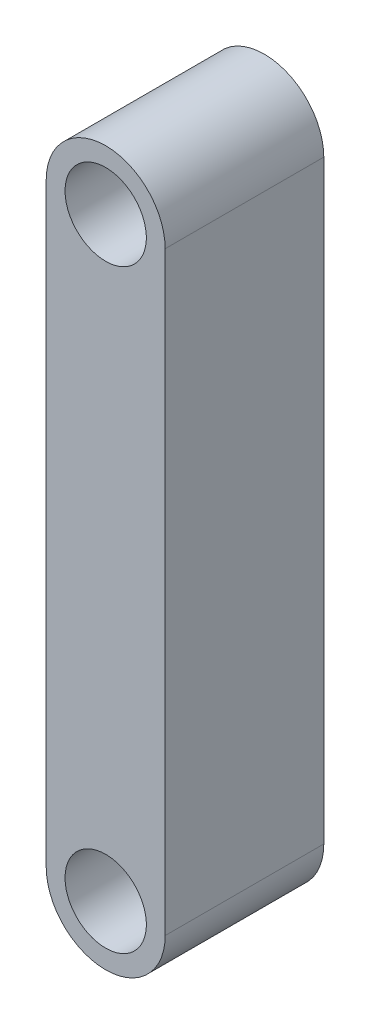
ISO-10303-21;
HEADER;
FILE_DESCRIPTION(('STEP AP214'),'2;1');
FILE_NAME('part.step','',(''),(''),'','','');
FILE_SCHEMA(('AUTOMOTIVE_DESIGN { 1 0 10303 214 1 1 1 1 }'));
ENDSEC;
DATA;
#1=APPLICATION_CONTEXT('core data for automotive mechanical design processes');
#2=APPLICATION_PROTOCOL_DEFINITION('international standard','automotive_design',2000,#1);
#3=PRODUCT_CONTEXT('',#1,'mechanical');
#4=PRODUCT('Part','Part','',(#3));
#5=PRODUCT_RELATED_PRODUCT_CATEGORY('part','',(#4));
#6=PRODUCT_DEFINITION_FORMATION('','',#4);
#7=PRODUCT_DEFINITION_CONTEXT('part definition',#1,'design');
#8=PRODUCT_DEFINITION('design','',#6,#7);
#9=PRODUCT_DEFINITION_SHAPE('','',#8);
#10=(LENGTH_UNIT() NAMED_UNIT(*) SI_UNIT(.MILLI.,.METRE.));
#11=(NAMED_UNIT(*) PLANE_ANGLE_UNIT() SI_UNIT($,.RADIAN.));
#12=(NAMED_UNIT(*) SI_UNIT($,.STERADIAN.) SOLID_ANGLE_UNIT());
#13=UNCERTAINTY_MEASURE_WITH_UNIT(LENGTH_MEASURE(1.E-05),#10,'distance_accuracy_value','');
#14=(GEOMETRIC_REPRESENTATION_CONTEXT(3) GLOBAL_UNCERTAINTY_ASSIGNED_CONTEXT((#13)) GLOBAL_UNIT_ASSIGNED_CONTEXT((#10,
#11,#12)) REPRESENTATION_CONTEXT('',''));
#15=CARTESIAN_POINT('',(0.,0.,0.));
#16=DIRECTION('',(0.,0.,1.));
#17=DIRECTION('',(1.,0.,0.));
#18=AXIS2_PLACEMENT_3D('',#15,#16,#17);
#19=CARTESIAN_POINT('',(3.,15.,8.));
#20=DIRECTION('',(1.,0.,0.));
#21=DIRECTION('',(0.,0.,-1.));
#22=AXIS2_PLACEMENT_3D('',#19,#20,#21);
#23=PLANE('',#22);
#24=DIRECTION('',(0.,-1.,0.));
#25=VECTOR('',#24,1.);
#26=CARTESIAN_POINT('',(3.,15.,0.));
#27=LINE('',#26,#25);
#28=CARTESIAN_POINT('',(3.,15.,0.));
#29=VERTEX_POINT('',#28);
#30=CARTESIAN_POINT('',(3.,-15.,0.));
#31=VERTEX_POINT('',#30);
#32=EDGE_CURVE('E117',#29,#31,#27,.T.);
#33=ORIENTED_EDGE('',*,*,#32,.F.);
#34=DIRECTION('',(0.,0.,-1.));
#35=VECTOR('',#34,1.);
#36=CARTESIAN_POINT('',(3.,15.,8.));
#37=LINE('',#36,#35);
#38=CARTESIAN_POINT('',(3.,15.,8.));
#39=VERTEX_POINT('',#38);
#40=EDGE_CURVE('E11',#39,#29,#37,.T.);
#41=ORIENTED_EDGE('',*,*,#40,.F.);
#42=DIRECTION('',(0.,-1.,0.));
#43=VECTOR('',#42,1.);
#44=CARTESIAN_POINT('',(3.,15.,8.));
#45=LINE('',#44,#43);
#46=CARTESIAN_POINT('',(3.,-15.,8.));
#47=VERTEX_POINT('',#46);
#48=EDGE_CURVE('E109',#39,#47,#45,.T.);
#49=ORIENTED_EDGE('',*,*,#48,.T.);
#50=DIRECTION('',(0.,0.,-1.));
#51=VECTOR('',#50,1.);
#52=CARTESIAN_POINT('',(3.,-15.,8.));
#53=LINE('',#52,#51);
#54=EDGE_CURVE('E48',#47,#31,#53,.T.);
#55=ORIENTED_EDGE('',*,*,#54,.T.);
#56=EDGE_LOOP('',(#33,#41,#49,#55));
#57=FACE_BOUND('',#56,.T.);
#58=ADVANCED_FACE('F45',(#57),#23,.T.);
#59=CARTESIAN_POINT('',(0.,15.,8.));
#60=DIRECTION('',(0.,0.,-1.));
#61=DIRECTION('',(-1.,0.,0.));
#62=AXIS2_PLACEMENT_3D('',#59,#60,#61);
#63=CYLINDRICAL_SURFACE('',#62,3.);
#64=CARTESIAN_POINT('',(0.,15.,0.));
#65=DIRECTION('',(0.,0.,1.));
#66=DIRECTION('',(1.,0.,0.));
#67=AXIS2_PLACEMENT_3D('',#64,#65,#66);
#68=CIRCLE('',#67,3.);
#69=CARTESIAN_POINT('',(-3.,15.,0.));
#70=VERTEX_POINT('',#69);
#71=EDGE_CURVE('E79',#29,#70,#68,.T.);
#72=ORIENTED_EDGE('',*,*,#71,.T.);
#73=DIRECTION('',(0.,0.,-1.));
#74=VECTOR('',#73,1.);
#75=CARTESIAN_POINT('',(-3.,15.,8.));
#76=LINE('',#75,#74);
#77=CARTESIAN_POINT('',(-3.,15.,8.));
#78=VERTEX_POINT('',#77);
#79=EDGE_CURVE('E55',#78,#70,#76,.T.);
#80=ORIENTED_EDGE('',*,*,#79,.F.);
#81=CARTESIAN_POINT('',(0.,15.,8.));
#82=DIRECTION('',(0.,0.,1.));
#83=DIRECTION('',(1.,0.,0.));
#84=AXIS2_PLACEMENT_3D('',#81,#82,#83);
#85=CIRCLE('',#84,3.);
#86=EDGE_CURVE('E94',#39,#78,#85,.T.);
#87=ORIENTED_EDGE('',*,*,#86,.F.);
#88=ORIENTED_EDGE('',*,*,#40,.T.);
#89=EDGE_LOOP('',(#72,#80,#87,#88));
#90=FACE_BOUND('',#89,.T.);
#91=ADVANCED_FACE('F134',(#90),#63,.T.);
#92=CARTESIAN_POINT('',(-3.,15.,8.));
#93=DIRECTION('',(1.,0.,0.));
#94=DIRECTION('',(0.,0.,-1.));
#95=AXIS2_PLACEMENT_3D('',#92,#93,#94);
#96=PLANE('',#95);
#97=DIRECTION('',(0.,-1.,0.));
#98=VECTOR('',#97,1.);
#99=CARTESIAN_POINT('',(-3.,15.,0.));
#100=LINE('',#99,#98);
#101=CARTESIAN_POINT('',(-3.,-15.,0.));
#102=VERTEX_POINT('',#101);
#103=EDGE_CURVE('E102',#70,#102,#100,.T.);
#104=ORIENTED_EDGE('',*,*,#103,.T.);
#105=DIRECTION('',(0.,0.,-1.));
#106=VECTOR('',#105,1.);
#107=CARTESIAN_POINT('',(-3.,-15.,8.));
#108=LINE('',#107,#106);
#109=CARTESIAN_POINT('',(-3.,-15.,8.));
#110=VERTEX_POINT('',#109);
#111=EDGE_CURVE('E99',#110,#102,#108,.T.);
#112=ORIENTED_EDGE('',*,*,#111,.F.);
#113=DIRECTION('',(0.,-1.,0.));
#114=VECTOR('',#113,1.);
#115=CARTESIAN_POINT('',(-3.,15.,8.));
#116=LINE('',#115,#114);
#117=EDGE_CURVE('E91',#78,#110,#116,.T.);
#118=ORIENTED_EDGE('',*,*,#117,.F.);
#119=ORIENTED_EDGE('',*,*,#79,.T.);
#120=EDGE_LOOP('',(#104,#112,#118,#119));
#121=FACE_BOUND('',#120,.T.);
#122=ADVANCED_FACE('F100',(#121),#96,.F.);
#123=CARTESIAN_POINT('',(0.,-15.,8.));
#124=DIRECTION('',(0.,0.,-1.));
#125=DIRECTION('',(-1.,0.,0.));
#126=AXIS2_PLACEMENT_3D('',#123,#124,#125);
#127=CYLINDRICAL_SURFACE('',#126,3.);
#128=CARTESIAN_POINT('',(0.,-15.,0.));
#129=DIRECTION('',(0.,0.,1.));
#130=DIRECTION('',(1.,0.,0.));
#131=AXIS2_PLACEMENT_3D('',#128,#129,#130);
#132=CIRCLE('',#131,3.);
#133=EDGE_CURVE('E121',#102,#31,#132,.T.);
#134=ORIENTED_EDGE('',*,*,#133,.T.);
#135=ORIENTED_EDGE('',*,*,#54,.F.);
#136=CARTESIAN_POINT('',(0.,-15.,8.));
#137=DIRECTION('',(0.,0.,1.));
#138=DIRECTION('',(1.,0.,0.));
#139=AXIS2_PLACEMENT_3D('',#136,#137,#138);
#140=CIRCLE('',#139,3.);
#141=EDGE_CURVE('E88',#110,#47,#140,.T.);
#142=ORIENTED_EDGE('',*,*,#141,.F.);
#143=ORIENTED_EDGE('',*,*,#111,.T.);
#144=EDGE_LOOP('',(#134,#135,#142,#143));
#145=FACE_BOUND('',#144,.T.);
#146=ADVANCED_FACE('F107',(#145),#127,.T.);
#147=CARTESIAN_POINT('',(0.,-15.,8.));
#148=DIRECTION('',(0.,0.,1.));
#149=DIRECTION('',(1.,0.,0.));
#150=AXIS2_PLACEMENT_3D('',#147,#148,#149);
#151=PLANE('',#150);
#152=CARTESIAN_POINT('',(0.,-15.,8.));
#153=DIRECTION('',(0.,0.,-1.));
#154=DIRECTION('',(-1.,0.,0.));
#155=AXIS2_PLACEMENT_3D('',#152,#153,#154);
#156=CIRCLE('',#155,2.05);
#157=CARTESIAN_POINT('',(-2.05,-15.,8.));
#158=VERTEX_POINT('',#157);
#159=EDGE_CURVE('E168',#158,#158,#156,.T.);
#160=ORIENTED_EDGE('',*,*,#159,.T.);
#161=EDGE_LOOP('',(#160));
#162=FACE_BOUND('',#161,.T.);
#163=CARTESIAN_POINT('',(0.,15.,8.));
#164=DIRECTION('',(0.,0.,-1.));
#165=DIRECTION('',(-1.,0.,0.));
#166=AXIS2_PLACEMENT_3D('',#163,#164,#165);
#167=CIRCLE('',#166,2.05);
#168=CARTESIAN_POINT('',(-2.05,15.,8.));
#169=VERTEX_POINT('',#168);
#170=EDGE_CURVE('E122',#169,#169,#167,.T.);
#171=ORIENTED_EDGE('',*,*,#170,.T.);
#172=EDGE_LOOP('',(#171));
#173=FACE_BOUND('',#172,.T.);
#174=ORIENTED_EDGE('',*,*,#48,.F.);
#175=ORIENTED_EDGE('',*,*,#86,.T.);
#176=ORIENTED_EDGE('',*,*,#117,.T.);
#177=ORIENTED_EDGE('',*,*,#141,.T.);
#178=EDGE_LOOP('',(#174,#175,#176,#177));
#179=FACE_BOUND('',#178,.T.);
#180=ADVANCED_FACE('F93',(#162,#173,#179),#151,.T.);
#181=CARTESIAN_POINT('',(0.,-15.,0.));
#182=DIRECTION('',(0.,0.,1.));
#183=DIRECTION('',(1.,0.,0.));
#184=AXIS2_PLACEMENT_3D('',#181,#182,#183);
#185=PLANE('',#184);
#186=CARTESIAN_POINT('',(0.,-15.,0.));
#187=DIRECTION('',(0.,0.,-1.));
#188=DIRECTION('',(-1.,0.,0.));
#189=AXIS2_PLACEMENT_3D('',#186,#187,#188);
#190=CIRCLE('',#189,2.05);
#191=CARTESIAN_POINT('',(-2.05,-15.,0.));
#192=VERTEX_POINT('',#191);
#193=EDGE_CURVE('E171',#192,#192,#190,.T.);
#194=ORIENTED_EDGE('',*,*,#193,.F.);
#195=EDGE_LOOP('',(#194));
#196=FACE_BOUND('',#195,.T.);
#197=CARTESIAN_POINT('',(0.,15.,0.));
#198=DIRECTION('',(0.,0.,-1.));
#199=DIRECTION('',(-1.,0.,0.));
#200=AXIS2_PLACEMENT_3D('',#197,#198,#199);
#201=CIRCLE('',#200,2.05);
#202=CARTESIAN_POINT('',(-2.05,15.,0.));
#203=VERTEX_POINT('',#202);
#204=EDGE_CURVE('E175',#203,#203,#201,.T.);
#205=ORIENTED_EDGE('',*,*,#204,.F.);
#206=EDGE_LOOP('',(#205));
#207=FACE_BOUND('',#206,.T.);
#208=ORIENTED_EDGE('',*,*,#32,.T.);
#209=ORIENTED_EDGE('',*,*,#133,.F.);
#210=ORIENTED_EDGE('',*,*,#103,.F.);
#211=ORIENTED_EDGE('',*,*,#71,.F.);
#212=EDGE_LOOP('',(#208,#209,#210,#211));
#213=FACE_BOUND('',#212,.T.);
#214=ADVANCED_FACE('F131',(#196,#207,#213),#185,.F.);
#215=CARTESIAN_POINT('',(0.,15.,0.));
#216=DIRECTION('',(0.,0.,-1.));
#217=DIRECTION('',(-1.,0.,0.));
#218=AXIS2_PLACEMENT_3D('',#215,#216,#217);
#219=CYLINDRICAL_SURFACE('',#218,2.05);
#220=ORIENTED_EDGE('',*,*,#170,.F.);
#221=EDGE_LOOP('',(#220));
#222=FACE_BOUND('',#221,.T.);
#223=ORIENTED_EDGE('',*,*,#204,.T.);
#224=EDGE_LOOP('',(#223));
#225=FACE_BOUND('',#224,.T.);
#226=ADVANCED_FACE('F154',(#222,#225),#219,.F.);
#227=CARTESIAN_POINT('',(0.,-15.,0.));
#228=DIRECTION('',(0.,0.,-1.));
#229=DIRECTION('',(-1.,0.,0.));
#230=AXIS2_PLACEMENT_3D('',#227,#228,#229);
#231=CYLINDRICAL_SURFACE('',#230,2.05);
#232=ORIENTED_EDGE('',*,*,#159,.F.);
#233=EDGE_LOOP('',(#232));
#234=FACE_BOUND('',#233,.T.);
#235=ORIENTED_EDGE('',*,*,#193,.T.);
#236=EDGE_LOOP('',(#235));
#237=FACE_BOUND('',#236,.T.);
#238=ADVANCED_FACE('F160',(#234,#237),#231,.F.);
#239=CLOSED_SHELL('',(#58,#91,#122,#146,#180,#214,#226,#238));
#240=MANIFOLD_SOLID_BREP('B2',#239);
#241=ADVANCED_BREP_SHAPE_REPRESENTATION('',(#18,#240),#14);
#242=SHAPE_DEFINITION_REPRESENTATION(#9,#241);
ENDSEC;
END-ISO-10303-21;
